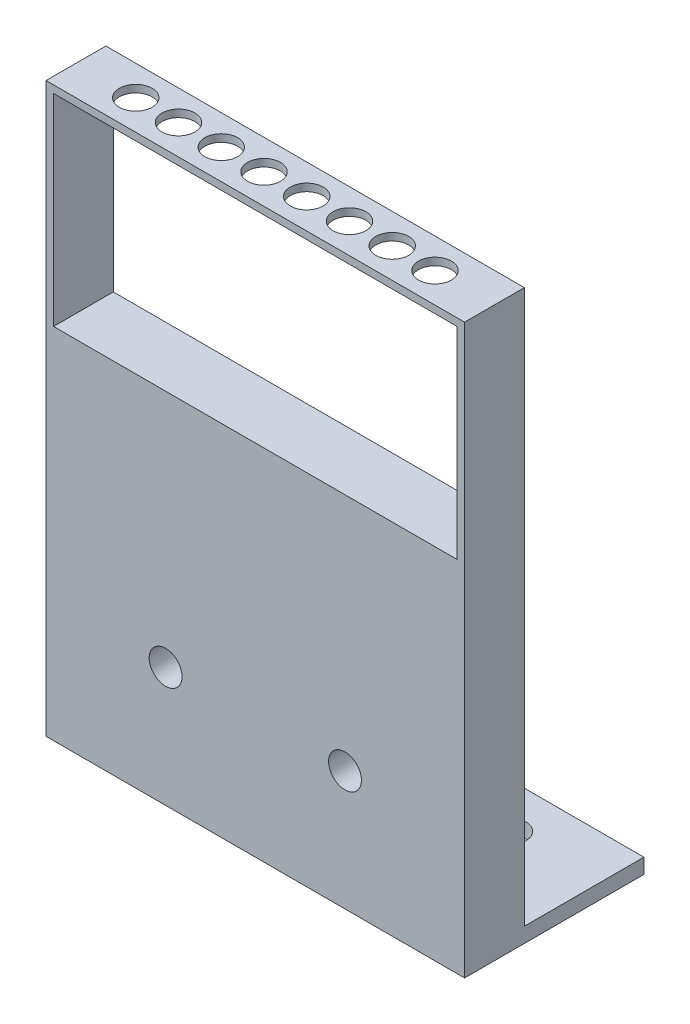
ISO-10303-21;
HEADER;
FILE_DESCRIPTION(('STEP AP214'),'2;1');
FILE_NAME('part.step','',(''),(''),'','','');
FILE_SCHEMA(('AUTOMOTIVE_DESIGN { 1 0 10303 214 1 1 1 1 }'));
ENDSEC;
DATA;
#1=APPLICATION_CONTEXT('core data for automotive mechanical design processes');
#2=APPLICATION_PROTOCOL_DEFINITION('international standard','automotive_design',2000,#1);
#3=PRODUCT_CONTEXT('',#1,'mechanical');
#4=PRODUCT('Part','Part','',(#3));
#5=PRODUCT_RELATED_PRODUCT_CATEGORY('part','',(#4));
#6=PRODUCT_DEFINITION_FORMATION('','',#4);
#7=PRODUCT_DEFINITION_CONTEXT('part definition',#1,'design');
#8=PRODUCT_DEFINITION('design','',#6,#7);
#9=PRODUCT_DEFINITION_SHAPE('','',#8);
#10=(LENGTH_UNIT() NAMED_UNIT(*) SI_UNIT(.MILLI.,.METRE.));
#11=(NAMED_UNIT(*) PLANE_ANGLE_UNIT() SI_UNIT($,.RADIAN.));
#12=(NAMED_UNIT(*) SI_UNIT($,.STERADIAN.) SOLID_ANGLE_UNIT());
#13=UNCERTAINTY_MEASURE_WITH_UNIT(LENGTH_MEASURE(1.E-05),#10,'distance_accuracy_value','');
#14=(GEOMETRIC_REPRESENTATION_CONTEXT(3) GLOBAL_UNCERTAINTY_ASSIGNED_CONTEXT((#13)) GLOBAL_UNIT_ASSIGNED_CONTEXT((#10,
#11,#12)) REPRESENTATION_CONTEXT('',''));
#15=CARTESIAN_POINT('',(0.,0.,0.));
#16=DIRECTION('',(0.,0.,1.));
#17=DIRECTION('',(1.,0.,0.));
#18=AXIS2_PLACEMENT_3D('',#15,#16,#17);
#19=CARTESIAN_POINT('',(-44.45,76.2,-6.35));
#20=DIRECTION('',(0.,0.,1.));
#21=DIRECTION('',(1.,0.,0.));
#22=AXIS2_PLACEMENT_3D('',#19,#20,#21);
#23=PLANE('',#22);
#24=CARTESIAN_POINT('',(19.05,25.4,-6.35));
#25=DIRECTION('',(0.,0.,1.));
#26=DIRECTION('',(1.,0.,0.));
#27=AXIS2_PLACEMENT_3D('',#24,#25,#26);
#28=CIRCLE('',#27,3.49250000000001);
#29=CARTESIAN_POINT('',(22.5425,25.4,-6.35));
#30=VERTEX_POINT('',#29);
#31=EDGE_CURVE('E290',#30,#30,#28,.T.);
#32=ORIENTED_EDGE('',*,*,#31,.T.);
#33=EDGE_LOOP('',(#32));
#34=FACE_BOUND('',#33,.T.);
#35=CARTESIAN_POINT('',(-19.05,25.4,-6.35));
#36=DIRECTION('',(0.,0.,1.));
#37=DIRECTION('',(1.,0.,0.));
#38=AXIS2_PLACEMENT_3D('',#35,#36,#37);
#39=CIRCLE('',#38,3.49250000000001);
#40=CARTESIAN_POINT('',(-15.5575,25.4,-6.35));
#41=VERTEX_POINT('',#40);
#42=EDGE_CURVE('E247',#41,#41,#39,.T.);
#43=ORIENTED_EDGE('',*,*,#42,.T.);
#44=EDGE_LOOP('',(#43));
#45=FACE_BOUND('',#44,.T.);
#46=DIRECTION('',(-1.,0.,0.));
#47=VECTOR('',#46,1.);
#48=CARTESIAN_POINT('',(-44.45,76.2,-6.35));
#49=LINE('',#48,#47);
#50=CARTESIAN_POINT('',(42.8625,76.2,-6.34999999999999));
#51=VERTEX_POINT('',#50);
#52=CARTESIAN_POINT('',(-42.8625,76.2,-6.35));
#53=VERTEX_POINT('',#52);
#54=EDGE_CURVE('E194',#51,#53,#49,.T.);
#55=ORIENTED_EDGE('',*,*,#54,.F.);
#56=DIRECTION('',(0.,1.,0.));
#57=VECTOR('',#56,1.);
#58=CARTESIAN_POINT('',(42.8625,76.2,-6.34999999999999));
#59=LINE('',#58,#57);
#60=CARTESIAN_POINT('',(42.8625,119.0625,-6.34999999999999));
#61=VERTEX_POINT('',#60);
#62=EDGE_CURVE('E235',#51,#61,#59,.T.);
#63=ORIENTED_EDGE('',*,*,#62,.T.);
#64=DIRECTION('',(-1.,0.,0.));
#65=VECTOR('',#64,1.);
#66=CARTESIAN_POINT('',(42.8625,119.0625,-6.34999999999999));
#67=LINE('',#66,#65);
#68=CARTESIAN_POINT('',(-42.8625,119.0625,-6.34999999999999));
#69=VERTEX_POINT('',#68);
#70=EDGE_CURVE('E147',#61,#69,#67,.T.);
#71=ORIENTED_EDGE('',*,*,#70,.T.);
#72=DIRECTION('',(0.,-1.,0.));
#73=VECTOR('',#72,1.);
#74=CARTESIAN_POINT('',(-42.8625,119.0625,-6.34999999999999));
#75=LINE('',#74,#73);
#76=EDGE_CURVE('E115',#69,#53,#75,.T.);
#77=ORIENTED_EDGE('',*,*,#76,.T.);
#78=EDGE_LOOP('',(#55,#63,#71,#77));
#79=FACE_BOUND('',#78,.T.);
#80=DIRECTION('',(1.,0.,0.));
#81=VECTOR('',#80,1.);
#82=CARTESIAN_POINT('',(-44.45,3.175,-6.35));
#83=LINE('',#82,#81);
#84=CARTESIAN_POINT('',(-44.45,3.17500000000003,-6.35));
#85=VERTEX_POINT('',#84);
#86=CARTESIAN_POINT('',(44.45,3.175,-6.35));
#87=VERTEX_POINT('',#86);
#88=EDGE_CURVE('E178',#85,#87,#83,.T.);
#89=ORIENTED_EDGE('',*,*,#88,.F.);
#90=DIRECTION('',(0.,-1.,0.));
#91=VECTOR('',#90,1.);
#92=CARTESIAN_POINT('',(-44.45,76.2,-6.35));
#93=LINE('',#92,#91);
#94=CARTESIAN_POINT('',(-44.45,120.65,-6.34999999999999));
#95=VERTEX_POINT('',#94);
#96=EDGE_CURVE('E41',#95,#85,#93,.T.);
#97=ORIENTED_EDGE('',*,*,#96,.F.);
#98=DIRECTION('',(1.,0.,0.));
#99=VECTOR('',#98,1.);
#100=CARTESIAN_POINT('',(-44.45,120.65,-6.34999999999999));
#101=LINE('',#100,#99);
#102=CARTESIAN_POINT('',(44.45,120.65,-6.34999999999999));
#103=VERTEX_POINT('',#102);
#104=EDGE_CURVE('E137',#95,#103,#101,.T.);
#105=ORIENTED_EDGE('',*,*,#104,.T.);
#106=DIRECTION('',(0.,-1.,0.));
#107=VECTOR('',#106,1.);
#108=CARTESIAN_POINT('',(44.45,76.2,-6.35));
#109=LINE('',#108,#107);
#110=EDGE_CURVE('E11',#103,#87,#109,.T.);
#111=ORIENTED_EDGE('',*,*,#110,.T.);
#112=EDGE_LOOP('',(#89,#97,#105,#111));
#113=FACE_BOUND('',#112,.T.);
#114=ADVANCED_FACE('F33',(#34,#45,#79,#113),#23,.F.);
#115=CARTESIAN_POINT('',(44.45,76.2,6.35));
#116=DIRECTION('',(-1.,0.,0.));
#117=DIRECTION('',(0.,0.,1.));
#118=AXIS2_PLACEMENT_3D('',#115,#116,#117);
#119=PLANE('',#118);
#120=DIRECTION('',(0.,0.,-1.));
#121=VECTOR('',#120,1.);
#122=CARTESIAN_POINT('',(44.45,0.,6.35));
#123=LINE('',#122,#121);
#124=CARTESIAN_POINT('',(44.45,0.,6.35));
#125=VERTEX_POINT('',#124);
#126=CARTESIAN_POINT('',(44.45,0.,-31.75));
#127=VERTEX_POINT('',#126);
#128=EDGE_CURVE('E193',#125,#127,#123,.T.);
#129=ORIENTED_EDGE('',*,*,#128,.T.);
#130=DIRECTION('',(0.,-1.,0.));
#131=VECTOR('',#130,1.);
#132=CARTESIAN_POINT('',(44.45,3.175,-31.75));
#133=LINE('',#132,#131);
#134=CARTESIAN_POINT('',(44.45,3.175,-31.75));
#135=VERTEX_POINT('',#134);
#136=EDGE_CURVE('E190',#135,#127,#133,.T.);
#137=ORIENTED_EDGE('',*,*,#136,.F.);
#138=DIRECTION('',(0.,0.,-1.));
#139=VECTOR('',#138,1.);
#140=CARTESIAN_POINT('',(44.45,3.175,-6.35));
#141=LINE('',#140,#139);
#142=EDGE_CURVE('E181',#87,#135,#141,.T.);
#143=ORIENTED_EDGE('',*,*,#142,.F.);
#144=ORIENTED_EDGE('',*,*,#110,.F.);
#145=DIRECTION('',(0.,0.,1.));
#146=VECTOR('',#145,1.);
#147=CARTESIAN_POINT('',(44.45,120.65,-105.743221599866));
#148=LINE('',#147,#146);
#149=CARTESIAN_POINT('',(44.45,120.65,6.35));
#150=VERTEX_POINT('',#149);
#151=EDGE_CURVE('E148',#103,#150,#148,.T.);
#152=ORIENTED_EDGE('',*,*,#151,.T.);
#153=DIRECTION('',(0.,-1.,0.));
#154=VECTOR('',#153,1.);
#155=CARTESIAN_POINT('',(44.45,76.2,6.35));
#156=LINE('',#155,#154);
#157=EDGE_CURVE('E198',#150,#125,#156,.T.);
#158=ORIENTED_EDGE('',*,*,#157,.T.);
#159=EDGE_LOOP('',(#129,#137,#143,#144,#152,#158));
#160=FACE_BOUND('',#159,.T.);
#161=ADVANCED_FACE('F35',(#160),#119,.F.);
#162=CARTESIAN_POINT('',(-44.45,76.2,6.35));
#163=DIRECTION('',(1.,0.,0.));
#164=DIRECTION('',(0.,0.,-1.));
#165=AXIS2_PLACEMENT_3D('',#162,#163,#164);
#166=PLANE('',#165);
#167=DIRECTION('',(0.,0.,1.));
#168=VECTOR('',#167,1.);
#169=CARTESIAN_POINT('',(-44.45,0.,6.35));
#170=LINE('',#169,#168);
#171=CARTESIAN_POINT('',(-44.45,0.,-31.75));
#172=VERTEX_POINT('',#171);
#173=CARTESIAN_POINT('',(-44.45,0.,6.35));
#174=VERTEX_POINT('',#173);
#175=EDGE_CURVE('E200',#172,#174,#170,.T.);
#176=ORIENTED_EDGE('',*,*,#175,.T.);
#177=DIRECTION('',(0.,-1.,0.));
#178=VECTOR('',#177,1.);
#179=CARTESIAN_POINT('',(-44.45,76.2,6.35));
#180=LINE('',#179,#178);
#181=CARTESIAN_POINT('',(-44.45,120.65,6.35));
#182=VERTEX_POINT('',#181);
#183=EDGE_CURVE('E205',#182,#174,#180,.T.);
#184=ORIENTED_EDGE('',*,*,#183,.F.);
#185=DIRECTION('',(0.,0.,1.));
#186=VECTOR('',#185,1.);
#187=CARTESIAN_POINT('',(-44.45,120.65,-105.743221599866));
#188=LINE('',#187,#186);
#189=EDGE_CURVE('E144',#95,#182,#188,.T.);
#190=ORIENTED_EDGE('',*,*,#189,.F.);
#191=ORIENTED_EDGE('',*,*,#96,.T.);
#192=DIRECTION('',(0.,0.,1.));
#193=VECTOR('',#192,1.);
#194=CARTESIAN_POINT('',(-44.45,3.175,-22.225));
#195=LINE('',#194,#193);
#196=CARTESIAN_POINT('',(-44.45,3.175,-31.75));
#197=VERTEX_POINT('',#196);
#198=EDGE_CURVE('E175',#197,#85,#195,.T.);
#199=ORIENTED_EDGE('',*,*,#198,.F.);
#200=DIRECTION('',(0.,-1.,0.));
#201=VECTOR('',#200,1.);
#202=CARTESIAN_POINT('',(-44.45,3.175,-31.75));
#203=LINE('',#202,#201);
#204=EDGE_CURVE('E185',#197,#172,#203,.T.);
#205=ORIENTED_EDGE('',*,*,#204,.T.);
#206=EDGE_LOOP('',(#176,#184,#190,#191,#199,#205));
#207=FACE_BOUND('',#206,.T.);
#208=ADVANCED_FACE('F211',(#207),#166,.F.);
#209=CARTESIAN_POINT('',(-44.45,76.2,6.35));
#210=DIRECTION('',(0.,0.,-1.));
#211=DIRECTION('',(-1.,0.,0.));
#212=AXIS2_PLACEMENT_3D('',#209,#210,#211);
#213=PLANE('',#212);
#214=CARTESIAN_POINT('',(19.05,25.4,6.35));
#215=DIRECTION('',(0.,0.,1.));
#216=DIRECTION('',(1.,0.,0.));
#217=AXIS2_PLACEMENT_3D('',#214,#215,#216);
#218=CIRCLE('',#217,3.49250000000001);
#219=CARTESIAN_POINT('',(22.5425,25.4,6.35));
#220=VERTEX_POINT('',#219);
#221=EDGE_CURVE('E293',#220,#220,#218,.T.);
#222=ORIENTED_EDGE('',*,*,#221,.F.);
#223=EDGE_LOOP('',(#222));
#224=FACE_BOUND('',#223,.T.);
#225=CARTESIAN_POINT('',(-19.05,25.4,6.35));
#226=DIRECTION('',(0.,0.,1.));
#227=DIRECTION('',(1.,0.,0.));
#228=AXIS2_PLACEMENT_3D('',#225,#226,#227);
#229=CIRCLE('',#228,3.49250000000001);
#230=CARTESIAN_POINT('',(-15.5575,25.4,6.35));
#231=VERTEX_POINT('',#230);
#232=EDGE_CURVE('E287',#231,#231,#229,.T.);
#233=ORIENTED_EDGE('',*,*,#232,.F.);
#234=EDGE_LOOP('',(#233));
#235=FACE_BOUND('',#234,.T.);
#236=DIRECTION('',(1.,0.,0.));
#237=VECTOR('',#236,1.);
#238=CARTESIAN_POINT('',(-44.45,76.2,6.35));
#239=LINE('',#238,#237);
#240=CARTESIAN_POINT('',(-42.8625,76.2,6.35));
#241=VERTEX_POINT('',#240);
#242=CARTESIAN_POINT('',(42.8625,76.2,6.35));
#243=VERTEX_POINT('',#242);
#244=EDGE_CURVE('E48',#241,#243,#239,.T.);
#245=ORIENTED_EDGE('',*,*,#244,.F.);
#246=DIRECTION('',(0.,1.,0.));
#247=VECTOR('',#246,1.);
#248=CARTESIAN_POINT('',(-42.8625,119.0625,6.35));
#249=LINE('',#248,#247);
#250=CARTESIAN_POINT('',(-42.8625,119.0625,6.35));
#251=VERTEX_POINT('',#250);
#252=EDGE_CURVE('E113',#241,#251,#249,.T.);
#253=ORIENTED_EDGE('',*,*,#252,.T.);
#254=DIRECTION('',(1.,0.,0.));
#255=VECTOR('',#254,1.);
#256=CARTESIAN_POINT('',(42.8625,119.0625,6.35));
#257=LINE('',#256,#255);
#258=CARTESIAN_POINT('',(42.8625,119.0625,6.35));
#259=VERTEX_POINT('',#258);
#260=EDGE_CURVE('E121',#251,#259,#257,.T.);
#261=ORIENTED_EDGE('',*,*,#260,.T.);
#262=DIRECTION('',(0.,-1.,0.));
#263=VECTOR('',#262,1.);
#264=CARTESIAN_POINT('',(42.8625,76.2,6.35));
#265=LINE('',#264,#263);
#266=EDGE_CURVE('E127',#259,#243,#265,.T.);
#267=ORIENTED_EDGE('',*,*,#266,.T.);
#268=EDGE_LOOP('',(#245,#253,#261,#267));
#269=FACE_BOUND('',#268,.T.);
#270=DIRECTION('',(1.,0.,0.));
#271=VECTOR('',#270,1.);
#272=CARTESIAN_POINT('',(-44.45,0.,6.35));
#273=LINE('',#272,#271);
#274=EDGE_CURVE('E196',#174,#125,#273,.T.);
#275=ORIENTED_EDGE('',*,*,#274,.T.);
#276=ORIENTED_EDGE('',*,*,#157,.F.);
#277=DIRECTION('',(-1.,0.,0.));
#278=VECTOR('',#277,1.);
#279=CARTESIAN_POINT('',(-44.45,120.65,6.35));
#280=LINE('',#279,#278);
#281=EDGE_CURVE('E141',#150,#182,#280,.T.);
#282=ORIENTED_EDGE('',*,*,#281,.T.);
#283=ORIENTED_EDGE('',*,*,#183,.T.);
#284=EDGE_LOOP('',(#275,#276,#282,#283));
#285=FACE_BOUND('',#284,.T.);
#286=ADVANCED_FACE('F129',(#224,#235,#269,#285),#213,.F.);
#287=CARTESIAN_POINT('',(0.,76.2,0.));
#288=DIRECTION('',(0.,-1.,0.));
#289=DIRECTION('',(0.,0.,-1.));
#290=AXIS2_PLACEMENT_3D('',#287,#288,#289);
#291=PLANE('',#290);
#292=ORIENTED_EDGE('',*,*,#244,.T.);
#293=DIRECTION('',(0.,0.,1.));
#294=VECTOR('',#293,1.);
#295=CARTESIAN_POINT('',(42.8625,76.2,-105.743221599866));
#296=LINE('',#295,#294);
#297=EDGE_CURVE('E151',#51,#243,#296,.T.);
#298=ORIENTED_EDGE('',*,*,#297,.F.);
#299=ORIENTED_EDGE('',*,*,#54,.T.);
#300=DIRECTION('',(0.,0.,1.));
#301=VECTOR('',#300,1.);
#302=CARTESIAN_POINT('',(-42.8625,76.2,-105.743221599866));
#303=LINE('',#302,#301);
#304=EDGE_CURVE('E53',#53,#241,#303,.T.);
#305=ORIENTED_EDGE('',*,*,#304,.T.);
#306=EDGE_LOOP('',(#292,#298,#299,#305));
#307=FACE_BOUND('',#306,.T.);
#308=ADVANCED_FACE('F302',(#307),#291,.F.);
#309=CARTESIAN_POINT('',(0.,0.,0.));
#310=DIRECTION('',(0.,-1.,0.));
#311=DIRECTION('',(0.,0.,-1.));
#312=AXIS2_PLACEMENT_3D('',#309,#310,#311);
#313=PLANE('',#312);
#314=ORIENTED_EDGE('',*,*,#128,.F.);
#315=ORIENTED_EDGE('',*,*,#274,.F.);
#316=ORIENTED_EDGE('',*,*,#175,.F.);
#317=DIRECTION('',(-1.,0.,0.));
#318=VECTOR('',#317,1.);
#319=CARTESIAN_POINT('',(44.45,0.,-31.75));
#320=LINE('',#319,#318);
#321=EDGE_CURVE('E172',#127,#172,#320,.T.);
#322=ORIENTED_EDGE('',*,*,#321,.F.);
#323=EDGE_LOOP('',(#314,#315,#316,#322));
#324=FACE_BOUND('',#323,.T.);
#325=CARTESIAN_POINT('',(-25.4,0.,-22.225));
#326=DIRECTION('',(0.,1.,0.));
#327=DIRECTION('',(0.,0.,1.));
#328=AXIS2_PLACEMENT_3D('',#325,#326,#327);
#329=CIRCLE('',#328,3.49250000000001);
#330=CARTESIAN_POINT('',(-25.4,0.,-18.7325));
#331=VERTEX_POINT('',#330);
#332=EDGE_CURVE('E166',#331,#331,#329,.T.);
#333=ORIENTED_EDGE('',*,*,#332,.T.);
#334=EDGE_LOOP('',(#333));
#335=FACE_BOUND('',#334,.T.);
#336=CARTESIAN_POINT('',(0.,0.,-22.225));
#337=DIRECTION('',(0.,1.,0.));
#338=DIRECTION('',(0.,0.,1.));
#339=AXIS2_PLACEMENT_3D('',#336,#337,#338);
#340=CIRCLE('',#339,3.49250000000001);
#341=CARTESIAN_POINT('',(0.,0.,-18.7325));
#342=VERTEX_POINT('',#341);
#343=EDGE_CURVE('E160',#342,#342,#340,.T.);
#344=ORIENTED_EDGE('',*,*,#343,.T.);
#345=EDGE_LOOP('',(#344));
#346=FACE_BOUND('',#345,.T.);
#347=CARTESIAN_POINT('',(25.4,0.,-22.225));
#348=DIRECTION('',(0.,1.,0.));
#349=DIRECTION('',(0.,0.,1.));
#350=AXIS2_PLACEMENT_3D('',#347,#348,#349);
#351=CIRCLE('',#350,3.4925);
#352=CARTESIAN_POINT('',(25.4,0.,-18.7325));
#353=VERTEX_POINT('',#352);
#354=EDGE_CURVE('E156',#353,#353,#351,.T.);
#355=ORIENTED_EDGE('',*,*,#354,.T.);
#356=EDGE_LOOP('',(#355));
#357=FACE_BOUND('',#356,.T.);
#358=ADVANCED_FACE('F229',(#324,#335,#346,#357),#313,.T.);
#359=CARTESIAN_POINT('',(0.,3.175,0.));
#360=DIRECTION('',(0.,1.,0.));
#361=DIRECTION('',(0.,0.,1.));
#362=AXIS2_PLACEMENT_3D('',#359,#360,#361);
#363=PLANE('',#362);
#364=CARTESIAN_POINT('',(0.,3.175,-22.225));
#365=DIRECTION('',(0.,1.,0.));
#366=DIRECTION('',(0.,0.,1.));
#367=AXIS2_PLACEMENT_3D('',#364,#365,#366);
#368=CIRCLE('',#367,3.49250000000001);
#369=CARTESIAN_POINT('',(0.,3.175,-18.7325));
#370=VERTEX_POINT('',#369);
#371=EDGE_CURVE('E163',#370,#370,#368,.T.);
#372=ORIENTED_EDGE('',*,*,#371,.F.);
#373=EDGE_LOOP('',(#372));
#374=FACE_BOUND('',#373,.T.);
#375=ORIENTED_EDGE('',*,*,#198,.T.);
#376=ORIENTED_EDGE('',*,*,#88,.T.);
#377=ORIENTED_EDGE('',*,*,#142,.T.);
#378=DIRECTION('',(-1.,0.,0.));
#379=VECTOR('',#378,1.);
#380=CARTESIAN_POINT('',(44.45,3.175,-31.75));
#381=LINE('',#380,#379);
#382=EDGE_CURVE('E183',#135,#197,#381,.T.);
#383=ORIENTED_EDGE('',*,*,#382,.T.);
#384=EDGE_LOOP('',(#375,#376,#377,#383));
#385=FACE_BOUND('',#384,.T.);
#386=CARTESIAN_POINT('',(-25.4,3.175,-22.225));
#387=DIRECTION('',(0.,1.,0.));
#388=DIRECTION('',(0.,0.,1.));
#389=AXIS2_PLACEMENT_3D('',#386,#387,#388);
#390=CIRCLE('',#389,3.49250000000001);
#391=CARTESIAN_POINT('',(-25.4,3.175,-18.7325));
#392=VERTEX_POINT('',#391);
#393=EDGE_CURVE('E169',#392,#392,#390,.T.);
#394=ORIENTED_EDGE('',*,*,#393,.F.);
#395=EDGE_LOOP('',(#394));
#396=FACE_BOUND('',#395,.T.);
#397=CARTESIAN_POINT('',(25.4,3.175,-22.225));
#398=DIRECTION('',(0.,1.,0.));
#399=DIRECTION('',(0.,0.,1.));
#400=AXIS2_PLACEMENT_3D('',#397,#398,#399);
#401=CIRCLE('',#400,3.4925);
#402=CARTESIAN_POINT('',(25.4,3.175,-18.7325));
#403=VERTEX_POINT('',#402);
#404=EDGE_CURVE('E157',#403,#403,#401,.T.);
#405=ORIENTED_EDGE('',*,*,#404,.F.);
#406=EDGE_LOOP('',(#405));
#407=FACE_BOUND('',#406,.T.);
#408=ADVANCED_FACE('F216',(#374,#385,#396,#407),#363,.T.);
#409=CARTESIAN_POINT('',(44.45,3.175,-31.75));
#410=DIRECTION('',(0.,0.,1.));
#411=DIRECTION('',(1.,0.,0.));
#412=AXIS2_PLACEMENT_3D('',#409,#410,#411);
#413=PLANE('',#412);
#414=ORIENTED_EDGE('',*,*,#321,.T.);
#415=ORIENTED_EDGE('',*,*,#204,.F.);
#416=ORIENTED_EDGE('',*,*,#382,.F.);
#417=ORIENTED_EDGE('',*,*,#136,.T.);
#418=EDGE_LOOP('',(#414,#415,#416,#417));
#419=FACE_BOUND('',#418,.T.);
#420=ADVANCED_FACE('F223',(#419),#413,.F.);
#421=CARTESIAN_POINT('',(-25.4,3.175,-22.225));
#422=DIRECTION('',(0.,-1.,0.));
#423=DIRECTION('',(0.,0.,-1.));
#424=AXIS2_PLACEMENT_3D('',#421,#422,#423);
#425=CYLINDRICAL_SURFACE('',#424,3.49250000000001);
#426=ORIENTED_EDGE('',*,*,#393,.T.);
#427=EDGE_LOOP('',(#426));
#428=FACE_BOUND('',#427,.T.);
#429=ORIENTED_EDGE('',*,*,#332,.F.);
#430=EDGE_LOOP('',(#429));
#431=FACE_BOUND('',#430,.T.);
#432=ADVANCED_FACE('F339',(#428,#431),#425,.F.);
#433=CARTESIAN_POINT('',(0.,3.175,-22.225));
#434=DIRECTION('',(0.,-1.,0.));
#435=DIRECTION('',(0.,0.,-1.));
#436=AXIS2_PLACEMENT_3D('',#433,#434,#435);
#437=CYLINDRICAL_SURFACE('',#436,3.49250000000001);
#438=ORIENTED_EDGE('',*,*,#371,.T.);
#439=EDGE_LOOP('',(#438));
#440=FACE_BOUND('',#439,.T.);
#441=ORIENTED_EDGE('',*,*,#343,.F.);
#442=EDGE_LOOP('',(#441));
#443=FACE_BOUND('',#442,.T.);
#444=ADVANCED_FACE('F335',(#440,#443),#437,.F.);
#445=CARTESIAN_POINT('',(25.4,3.175,-22.225));
#446=DIRECTION('',(0.,-1.,0.));
#447=DIRECTION('',(0.,0.,-1.));
#448=AXIS2_PLACEMENT_3D('',#445,#446,#447);
#449=CYLINDRICAL_SURFACE('',#448,3.4925);
#450=ORIENTED_EDGE('',*,*,#404,.T.);
#451=EDGE_LOOP('',(#450));
#452=FACE_BOUND('',#451,.T.);
#453=ORIENTED_EDGE('',*,*,#354,.F.);
#454=EDGE_LOOP('',(#453));
#455=FACE_BOUND('',#454,.T.);
#456=ADVANCED_FACE('F325',(#452,#455),#449,.F.);
#457=CARTESIAN_POINT('',(-44.45,120.65,-105.743221599866));
#458=DIRECTION('',(0.,1.,0.));
#459=DIRECTION('',(0.,0.,1.));
#460=AXIS2_PLACEMENT_3D('',#457,#458,#459);
#461=PLANE('',#460);
#462=CARTESIAN_POINT('',(-22.6695,120.65,0.));
#463=DIRECTION('',(0.,1.,0.));
#464=DIRECTION('',(0.,0.,1.));
#465=AXIS2_PLACEMENT_3D('',#462,#463,#464);
#466=CIRCLE('',#465,3.4925);
#467=CARTESIAN_POINT('',(-22.6695,120.65,3.4925));
#468=VERTEX_POINT('',#467);
#469=EDGE_CURVE('E241',#468,#468,#466,.T.);
#470=ORIENTED_EDGE('',*,*,#469,.F.);
#471=EDGE_LOOP('',(#470));
#472=FACE_BOUND('',#471,.T.);
#473=CARTESIAN_POINT('',(-13.589,120.65,0.));
#474=DIRECTION('',(0.,1.,0.));
#475=DIRECTION('',(0.,0.,1.));
#476=AXIS2_PLACEMENT_3D('',#473,#474,#475);
#477=CIRCLE('',#476,3.49250000000001);
#478=CARTESIAN_POINT('',(-13.589,120.65,3.49250000000001));
#479=VERTEX_POINT('',#478);
#480=EDGE_CURVE('E277',#479,#479,#477,.T.);
#481=ORIENTED_EDGE('',*,*,#480,.F.);
#482=EDGE_LOOP('',(#481));
#483=FACE_BOUND('',#482,.T.);
#484=CARTESIAN_POINT('',(-4.5085,120.65,0.));
#485=DIRECTION('',(0.,1.,0.));
#486=DIRECTION('',(0.,0.,1.));
#487=AXIS2_PLACEMENT_3D('',#484,#485,#486);
#488=CIRCLE('',#487,3.49250000000001);
#489=CARTESIAN_POINT('',(-4.5085,120.65,3.49250000000001));
#490=VERTEX_POINT('',#489);
#491=EDGE_CURVE('E271',#490,#490,#488,.T.);
#492=ORIENTED_EDGE('',*,*,#491,.F.);
#493=EDGE_LOOP('',(#492));
#494=FACE_BOUND('',#493,.T.);
#495=CARTESIAN_POINT('',(4.572,120.65,0.));
#496=DIRECTION('',(0.,1.,0.));
#497=DIRECTION('',(0.,0.,1.));
#498=AXIS2_PLACEMENT_3D('',#495,#496,#497);
#499=CIRCLE('',#498,3.4925);
#500=CARTESIAN_POINT('',(4.572,120.65,3.4925));
#501=VERTEX_POINT('',#500);
#502=EDGE_CURVE('E265',#501,#501,#499,.T.);
#503=ORIENTED_EDGE('',*,*,#502,.F.);
#504=EDGE_LOOP('',(#503));
#505=FACE_BOUND('',#504,.T.);
#506=CARTESIAN_POINT('',(13.6525,120.65,0.));
#507=DIRECTION('',(0.,1.,0.));
#508=DIRECTION('',(0.,0.,1.));
#509=AXIS2_PLACEMENT_3D('',#506,#507,#508);
#510=CIRCLE('',#509,3.4925);
#511=CARTESIAN_POINT('',(13.6525,120.65,3.4925));
#512=VERTEX_POINT('',#511);
#513=EDGE_CURVE('E259',#512,#512,#510,.T.);
#514=ORIENTED_EDGE('',*,*,#513,.F.);
#515=EDGE_LOOP('',(#514));
#516=FACE_BOUND('',#515,.T.);
#517=CARTESIAN_POINT('',(22.733,120.65,0.));
#518=DIRECTION('',(0.,1.,0.));
#519=DIRECTION('',(0.,0.,1.));
#520=AXIS2_PLACEMENT_3D('',#517,#518,#519);
#521=CIRCLE('',#520,3.49250000000001);
#522=CARTESIAN_POINT('',(22.733,120.65,3.49250000000001));
#523=VERTEX_POINT('',#522);
#524=EDGE_CURVE('E253',#523,#523,#521,.T.);
#525=ORIENTED_EDGE('',*,*,#524,.F.);
#526=EDGE_LOOP('',(#525));
#527=FACE_BOUND('',#526,.T.);
#528=CARTESIAN_POINT('',(31.8135,120.65,0.));
#529=DIRECTION('',(0.,1.,0.));
#530=DIRECTION('',(0.,0.,1.));
#531=AXIS2_PLACEMENT_3D('',#528,#529,#530);
#532=CIRCLE('',#531,3.49250000000001);
#533=CARTESIAN_POINT('',(31.8135,120.65,3.49250000000001));
#534=VERTEX_POINT('',#533);
#535=EDGE_CURVE('E246',#534,#534,#532,.T.);
#536=ORIENTED_EDGE('',*,*,#535,.F.);
#537=EDGE_LOOP('',(#536));
#538=FACE_BOUND('',#537,.T.);
#539=CARTESIAN_POINT('',(-31.75,120.65,0.));
#540=DIRECTION('',(0.,1.,0.));
#541=DIRECTION('',(0.,0.,1.));
#542=AXIS2_PLACEMENT_3D('',#539,#540,#541);
#543=CIRCLE('',#542,3.4925);
#544=CARTESIAN_POINT('',(-31.75,120.65,3.4925));
#545=VERTEX_POINT('',#544);
#546=EDGE_CURVE('E131',#545,#545,#543,.T.);
#547=ORIENTED_EDGE('',*,*,#546,.F.);
#548=EDGE_LOOP('',(#547));
#549=FACE_BOUND('',#548,.T.);
#550=ORIENTED_EDGE('',*,*,#104,.F.);
#551=ORIENTED_EDGE('',*,*,#189,.T.);
#552=ORIENTED_EDGE('',*,*,#281,.F.);
#553=ORIENTED_EDGE('',*,*,#151,.F.);
#554=EDGE_LOOP('',(#550,#551,#552,#553));
#555=FACE_BOUND('',#554,.T.);
#556=ADVANCED_FACE('F234',(#472,#483,#494,#505,#516,#527,#538,#549,#555),#461,.T.);
#557=CARTESIAN_POINT('',(42.8625,76.2,-105.743221599866));
#558=DIRECTION('',(-1.,0.,0.));
#559=DIRECTION('',(0.,0.,1.));
#560=AXIS2_PLACEMENT_3D('',#557,#558,#559);
#561=PLANE('',#560);
#562=ORIENTED_EDGE('',*,*,#62,.F.);
#563=ORIENTED_EDGE('',*,*,#297,.T.);
#564=ORIENTED_EDGE('',*,*,#266,.F.);
#565=DIRECTION('',(0.,0.,1.));
#566=VECTOR('',#565,1.);
#567=CARTESIAN_POINT('',(42.8625,119.0625,-105.743221599866));
#568=LINE('',#567,#566);
#569=EDGE_CURVE('E118',#61,#259,#568,.T.);
#570=ORIENTED_EDGE('',*,*,#569,.F.);
#571=EDGE_LOOP('',(#562,#563,#564,#570));
#572=FACE_BOUND('',#571,.T.);
#573=ADVANCED_FACE('F316',(#572),#561,.T.);
#574=CARTESIAN_POINT('',(42.8625,119.0625,-105.743221599866));
#575=DIRECTION('',(0.,-1.,0.));
#576=DIRECTION('',(0.,0.,-1.));
#577=AXIS2_PLACEMENT_3D('',#574,#575,#576);
#578=PLANE('',#577);
#579=CARTESIAN_POINT('',(-22.6695,119.0625,0.));
#580=DIRECTION('',(0.,-1.,0.));
#581=DIRECTION('',(0.,0.,-1.));
#582=AXIS2_PLACEMENT_3D('',#579,#580,#581);
#583=CIRCLE('',#582,3.4925);
#584=CARTESIAN_POINT('',(-22.6695,119.0625,-3.4925));
#585=VERTEX_POINT('',#584);
#586=EDGE_CURVE('E280',#585,#585,#583,.F.);
#587=ORIENTED_EDGE('',*,*,#586,.T.);
#588=EDGE_LOOP('',(#587));
#589=FACE_BOUND('',#588,.T.);
#590=CARTESIAN_POINT('',(-13.589,119.0625,0.));
#591=DIRECTION('',(0.,-1.,0.));
#592=DIRECTION('',(0.,0.,-1.));
#593=AXIS2_PLACEMENT_3D('',#590,#591,#592);
#594=CIRCLE('',#593,3.49250000000001);
#595=CARTESIAN_POINT('',(-13.589,119.0625,-3.49250000000001));
#596=VERTEX_POINT('',#595);
#597=EDGE_CURVE('E274',#596,#596,#594,.F.);
#598=ORIENTED_EDGE('',*,*,#597,.T.);
#599=EDGE_LOOP('',(#598));
#600=FACE_BOUND('',#599,.T.);
#601=CARTESIAN_POINT('',(-4.5085,119.0625,0.));
#602=DIRECTION('',(0.,-1.,0.));
#603=DIRECTION('',(0.,0.,-1.));
#604=AXIS2_PLACEMENT_3D('',#601,#602,#603);
#605=CIRCLE('',#604,3.49250000000001);
#606=CARTESIAN_POINT('',(-4.5085,119.0625,-3.49250000000001));
#607=VERTEX_POINT('',#606);
#608=EDGE_CURVE('E268',#607,#607,#605,.F.);
#609=ORIENTED_EDGE('',*,*,#608,.T.);
#610=EDGE_LOOP('',(#609));
#611=FACE_BOUND('',#610,.T.);
#612=CARTESIAN_POINT('',(4.572,119.0625,0.));
#613=DIRECTION('',(0.,-1.,0.));
#614=DIRECTION('',(0.,0.,-1.));
#615=AXIS2_PLACEMENT_3D('',#612,#613,#614);
#616=CIRCLE('',#615,3.4925);
#617=CARTESIAN_POINT('',(4.572,119.0625,-3.4925));
#618=VERTEX_POINT('',#617);
#619=EDGE_CURVE('E262',#618,#618,#616,.F.);
#620=ORIENTED_EDGE('',*,*,#619,.T.);
#621=EDGE_LOOP('',(#620));
#622=FACE_BOUND('',#621,.T.);
#623=CARTESIAN_POINT('',(13.6525,119.0625,0.));
#624=DIRECTION('',(0.,-1.,0.));
#625=DIRECTION('',(0.,0.,-1.));
#626=AXIS2_PLACEMENT_3D('',#623,#624,#625);
#627=CIRCLE('',#626,3.4925);
#628=CARTESIAN_POINT('',(13.6525,119.0625,-3.4925));
#629=VERTEX_POINT('',#628);
#630=EDGE_CURVE('E256',#629,#629,#627,.F.);
#631=ORIENTED_EDGE('',*,*,#630,.T.);
#632=EDGE_LOOP('',(#631));
#633=FACE_BOUND('',#632,.T.);
#634=CARTESIAN_POINT('',(22.733,119.0625,0.));
#635=DIRECTION('',(0.,-1.,0.));
#636=DIRECTION('',(0.,0.,-1.));
#637=AXIS2_PLACEMENT_3D('',#634,#635,#636);
#638=CIRCLE('',#637,3.49250000000001);
#639=CARTESIAN_POINT('',(22.733,119.0625,-3.49250000000001));
#640=VERTEX_POINT('',#639);
#641=EDGE_CURVE('E250',#640,#640,#638,.F.);
#642=ORIENTED_EDGE('',*,*,#641,.T.);
#643=EDGE_LOOP('',(#642));
#644=FACE_BOUND('',#643,.T.);
#645=CARTESIAN_POINT('',(31.8135,119.0625,0.));
#646=DIRECTION('',(0.,-1.,0.));
#647=DIRECTION('',(0.,0.,-1.));
#648=AXIS2_PLACEMENT_3D('',#645,#646,#647);
#649=CIRCLE('',#648,3.49250000000001);
#650=CARTESIAN_POINT('',(31.8135,119.0625,-3.49250000000001));
#651=VERTEX_POINT('',#650);
#652=EDGE_CURVE('E243',#651,#651,#649,.F.);
#653=ORIENTED_EDGE('',*,*,#652,.T.);
#654=EDGE_LOOP('',(#653));
#655=FACE_BOUND('',#654,.T.);
#656=CARTESIAN_POINT('',(-31.75,119.0625,0.));
#657=DIRECTION('',(0.,-1.,0.));
#658=DIRECTION('',(0.,0.,-1.));
#659=AXIS2_PLACEMENT_3D('',#656,#657,#658);
#660=CIRCLE('',#659,3.4925);
#661=CARTESIAN_POINT('',(-31.75,119.0625,-3.4925));
#662=VERTEX_POINT('',#661);
#663=EDGE_CURVE('E134',#662,#662,#660,.F.);
#664=ORIENTED_EDGE('',*,*,#663,.T.);
#665=EDGE_LOOP('',(#664));
#666=FACE_BOUND('',#665,.T.);
#667=ORIENTED_EDGE('',*,*,#70,.F.);
#668=ORIENTED_EDGE('',*,*,#569,.T.);
#669=ORIENTED_EDGE('',*,*,#260,.F.);
#670=DIRECTION('',(0.,0.,1.));
#671=VECTOR('',#670,1.);
#672=CARTESIAN_POINT('',(-42.8625,119.0625,-105.743221599866));
#673=LINE('',#672,#671);
#674=EDGE_CURVE('E109',#69,#251,#673,.T.);
#675=ORIENTED_EDGE('',*,*,#674,.F.);
#676=EDGE_LOOP('',(#667,#668,#669,#675));
#677=FACE_BOUND('',#676,.T.);
#678=ADVANCED_FACE('F122',(#589,#600,#611,#622,#633,#644,#655,#666,#677),#578,.T.);
#679=CARTESIAN_POINT('',(-42.8625,119.0625,-105.743221599866));
#680=DIRECTION('',(1.,0.,0.));
#681=DIRECTION('',(0.,1.,0.));
#682=AXIS2_PLACEMENT_3D('',#679,#680,#681);
#683=PLANE('',#682);
#684=ORIENTED_EDGE('',*,*,#76,.F.);
#685=ORIENTED_EDGE('',*,*,#674,.T.);
#686=ORIENTED_EDGE('',*,*,#252,.F.);
#687=ORIENTED_EDGE('',*,*,#304,.F.);
#688=EDGE_LOOP('',(#684,#685,#686,#687));
#689=FACE_BOUND('',#688,.T.);
#690=ADVANCED_FACE('F111',(#689),#683,.T.);
#691=CARTESIAN_POINT('',(-31.75,-0.001000000000001,0.));
#692=DIRECTION('',(0.,1.,0.));
#693=DIRECTION('',(0.,0.,1.));
#694=AXIS2_PLACEMENT_3D('',#691,#692,#693);
#695=CYLINDRICAL_SURFACE('',#694,3.4925);
#696=ORIENTED_EDGE('',*,*,#663,.F.);
#697=EDGE_LOOP('',(#696));
#698=FACE_BOUND('',#697,.T.);
#699=ORIENTED_EDGE('',*,*,#546,.T.);
#700=EDGE_LOOP('',(#699));
#701=FACE_BOUND('',#700,.T.);
#702=ADVANCED_FACE('F332',(#698,#701),#695,.F.);
#703=CARTESIAN_POINT('',(31.8135,-0.001000000000001,0.));
#704=DIRECTION('',(0.,1.,0.));
#705=DIRECTION('',(0.,0.,1.));
#706=AXIS2_PLACEMENT_3D('',#703,#704,#705);
#707=CYLINDRICAL_SURFACE('',#706,3.49250000000001);
#708=ORIENTED_EDGE('',*,*,#652,.F.);
#709=EDGE_LOOP('',(#708));
#710=FACE_BOUND('',#709,.T.);
#711=ORIENTED_EDGE('',*,*,#535,.T.);
#712=EDGE_LOOP('',(#711));
#713=FACE_BOUND('',#712,.T.);
#714=ADVANCED_FACE('F420',(#710,#713),#707,.F.);
#715=CARTESIAN_POINT('',(22.733,-0.001000000000001,0.));
#716=DIRECTION('',(0.,1.,0.));
#717=DIRECTION('',(0.,0.,1.));
#718=AXIS2_PLACEMENT_3D('',#715,#716,#717);
#719=CYLINDRICAL_SURFACE('',#718,3.49250000000001);
#720=ORIENTED_EDGE('',*,*,#641,.F.);
#721=EDGE_LOOP('',(#720));
#722=FACE_BOUND('',#721,.T.);
#723=ORIENTED_EDGE('',*,*,#524,.T.);
#724=EDGE_LOOP('',(#723));
#725=FACE_BOUND('',#724,.T.);
#726=ADVANCED_FACE('F416',(#722,#725),#719,.F.);
#727=CARTESIAN_POINT('',(13.6525,-0.001000000000001,0.));
#728=DIRECTION('',(0.,1.,0.));
#729=DIRECTION('',(0.,0.,1.));
#730=AXIS2_PLACEMENT_3D('',#727,#728,#729);
#731=CYLINDRICAL_SURFACE('',#730,3.4925);
#732=ORIENTED_EDGE('',*,*,#630,.F.);
#733=EDGE_LOOP('',(#732));
#734=FACE_BOUND('',#733,.T.);
#735=ORIENTED_EDGE('',*,*,#513,.T.);
#736=EDGE_LOOP('',(#735));
#737=FACE_BOUND('',#736,.T.);
#738=ADVANCED_FACE('F412',(#734,#737),#731,.F.);
#739=CARTESIAN_POINT('',(4.572,-0.001000000000001,0.));
#740=DIRECTION('',(0.,1.,0.));
#741=DIRECTION('',(0.,0.,1.));
#742=AXIS2_PLACEMENT_3D('',#739,#740,#741);
#743=CYLINDRICAL_SURFACE('',#742,3.4925);
#744=ORIENTED_EDGE('',*,*,#619,.F.);
#745=EDGE_LOOP('',(#744));
#746=FACE_BOUND('',#745,.T.);
#747=ORIENTED_EDGE('',*,*,#502,.T.);
#748=EDGE_LOOP('',(#747));
#749=FACE_BOUND('',#748,.T.);
#750=ADVANCED_FACE('F408',(#746,#749),#743,.F.);
#751=CARTESIAN_POINT('',(-4.5085,-0.001000000000001,0.));
#752=DIRECTION('',(0.,1.,0.));
#753=DIRECTION('',(0.,0.,1.));
#754=AXIS2_PLACEMENT_3D('',#751,#752,#753);
#755=CYLINDRICAL_SURFACE('',#754,3.49250000000001);
#756=ORIENTED_EDGE('',*,*,#608,.F.);
#757=EDGE_LOOP('',(#756));
#758=FACE_BOUND('',#757,.T.);
#759=ORIENTED_EDGE('',*,*,#491,.T.);
#760=EDGE_LOOP('',(#759));
#761=FACE_BOUND('',#760,.T.);
#762=ADVANCED_FACE('F404',(#758,#761),#755,.F.);
#763=CARTESIAN_POINT('',(-13.589,-0.001000000000001,0.));
#764=DIRECTION('',(0.,1.,0.));
#765=DIRECTION('',(0.,0.,1.));
#766=AXIS2_PLACEMENT_3D('',#763,#764,#765);
#767=CYLINDRICAL_SURFACE('',#766,3.49250000000001);
#768=ORIENTED_EDGE('',*,*,#597,.F.);
#769=EDGE_LOOP('',(#768));
#770=FACE_BOUND('',#769,.T.);
#771=ORIENTED_EDGE('',*,*,#480,.T.);
#772=EDGE_LOOP('',(#771));
#773=FACE_BOUND('',#772,.T.);
#774=ADVANCED_FACE('F400',(#770,#773),#767,.F.);
#775=CARTESIAN_POINT('',(-22.6695,-0.001000000000001,0.));
#776=DIRECTION('',(0.,1.,0.));
#777=DIRECTION('',(0.,0.,1.));
#778=AXIS2_PLACEMENT_3D('',#775,#776,#777);
#779=CYLINDRICAL_SURFACE('',#778,3.4925);
#780=ORIENTED_EDGE('',*,*,#586,.F.);
#781=EDGE_LOOP('',(#780));
#782=FACE_BOUND('',#781,.T.);
#783=ORIENTED_EDGE('',*,*,#469,.T.);
#784=EDGE_LOOP('',(#783));
#785=FACE_BOUND('',#784,.T.);
#786=ADVANCED_FACE('F309',(#782,#785),#779,.F.);
#787=CARTESIAN_POINT('',(-19.05,25.4,-31.75));
#788=DIRECTION('',(0.,0.,1.));
#789=DIRECTION('',(1.,0.,0.));
#790=AXIS2_PLACEMENT_3D('',#787,#788,#789);
#791=CYLINDRICAL_SURFACE('',#790,3.49250000000001);
#792=ORIENTED_EDGE('',*,*,#232,.T.);
#793=EDGE_LOOP('',(#792));
#794=FACE_BOUND('',#793,.T.);
#795=ORIENTED_EDGE('',*,*,#42,.F.);
#796=EDGE_LOOP('',(#795));
#797=FACE_BOUND('',#796,.T.);
#798=ADVANCED_FACE('F306',(#794,#797),#791,.F.);
#799=CARTESIAN_POINT('',(19.05,25.4,-31.75));
#800=DIRECTION('',(0.,0.,1.));
#801=DIRECTION('',(1.,0.,0.));
#802=AXIS2_PLACEMENT_3D('',#799,#800,#801);
#803=CYLINDRICAL_SURFACE('',#802,3.49250000000001);
#804=ORIENTED_EDGE('',*,*,#221,.T.);
#805=EDGE_LOOP('',(#804));
#806=FACE_BOUND('',#805,.T.);
#807=ORIENTED_EDGE('',*,*,#31,.F.);
#808=EDGE_LOOP('',(#807));
#809=FACE_BOUND('',#808,.T.);
#810=ADVANCED_FACE('F297',(#806,#809),#803,.F.);
#811=CLOSED_SHELL('',(#114,#161,#208,#286,#308,#358,#408,#420,#432,#444,#456,#556,#573,#678,
#690,#702,#714,#726,#738,#750,#762,#774,#786,#798,#810));
#812=MANIFOLD_SOLID_BREP('B2',#811);
#813=ADVANCED_BREP_SHAPE_REPRESENTATION('',(#18,#812),#14);
#814=SHAPE_DEFINITION_REPRESENTATION(#9,#813);
ENDSEC;
END-ISO-10303-21;
